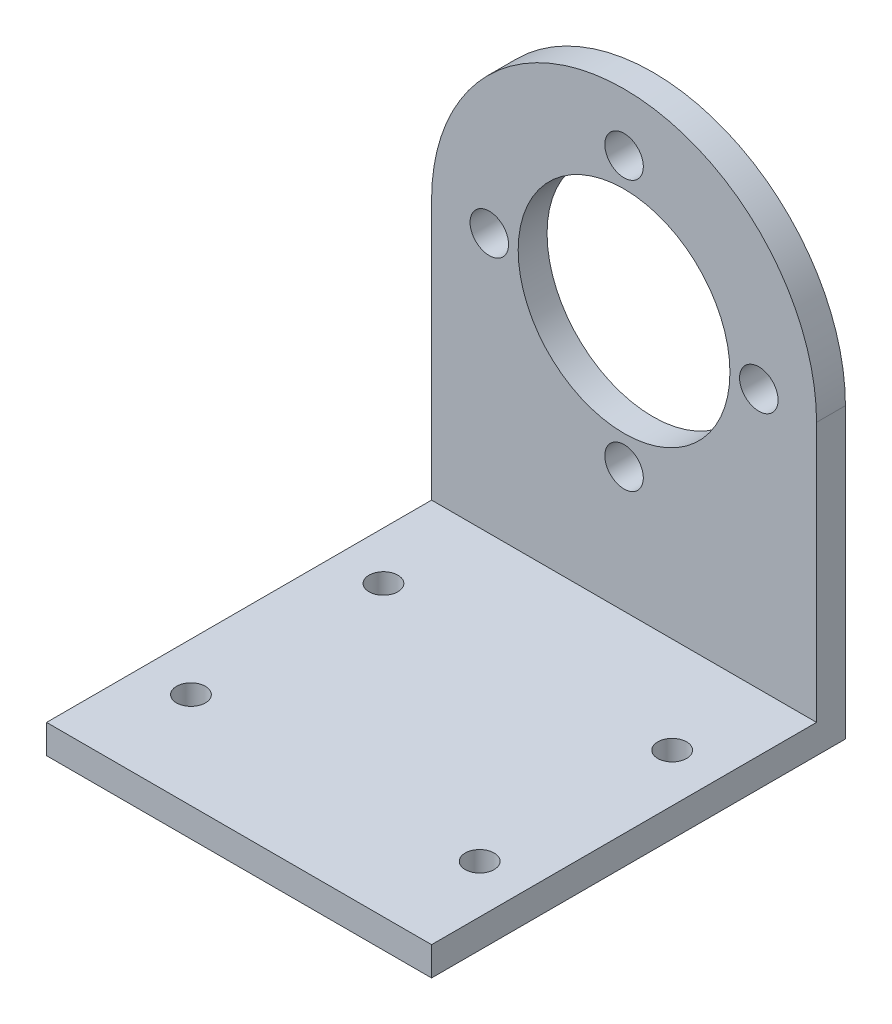
ISO-10303-21;
HEADER;
FILE_DESCRIPTION(('STEP AP214'),'2;1');
FILE_NAME('part.step','',(''),(''),'','','');
FILE_SCHEMA(('AUTOMOTIVE_DESIGN { 1 0 10303 214 1 1 1 1 }'));
ENDSEC;
DATA;
#1=APPLICATION_CONTEXT('core data for automotive mechanical design processes');
#2=APPLICATION_PROTOCOL_DEFINITION('international standard','automotive_design',2000,#1);
#3=PRODUCT_CONTEXT('',#1,'mechanical');
#4=PRODUCT('Part','Part','',(#3));
#5=PRODUCT_RELATED_PRODUCT_CATEGORY('part','',(#4));
#6=PRODUCT_DEFINITION_FORMATION('','',#4);
#7=PRODUCT_DEFINITION_CONTEXT('part definition',#1,'design');
#8=PRODUCT_DEFINITION('design','',#6,#7);
#9=PRODUCT_DEFINITION_SHAPE('','',#8);
#10=(LENGTH_UNIT() NAMED_UNIT(*) SI_UNIT(.MILLI.,.METRE.));
#11=(NAMED_UNIT(*) PLANE_ANGLE_UNIT() SI_UNIT($,.RADIAN.));
#12=(NAMED_UNIT(*) SI_UNIT($,.STERADIAN.) SOLID_ANGLE_UNIT());
#13=UNCERTAINTY_MEASURE_WITH_UNIT(LENGTH_MEASURE(1.E-05),#10,'distance_accuracy_value','');
#14=(GEOMETRIC_REPRESENTATION_CONTEXT(3) GLOBAL_UNCERTAINTY_ASSIGNED_CONTEXT((#13)) GLOBAL_UNIT_ASSIGNED_CONTEXT((#10,
#11,#12)) REPRESENTATION_CONTEXT('',''));
#15=CARTESIAN_POINT('',(0.,0.,0.));
#16=DIRECTION('',(0.,0.,1.));
#17=DIRECTION('',(1.,0.,0.));
#18=AXIS2_PLACEMENT_3D('',#15,#16,#17);
#19=CARTESIAN_POINT('',(0.,3.,0.));
#20=DIRECTION('',(0.,1.,0.));
#21=DIRECTION('',(0.,0.,1.));
#22=AXIS2_PLACEMENT_3D('',#19,#20,#21);
#23=PLANE('',#22);
#24=DIRECTION('',(1.,0.,0.));
#25=VECTOR('',#24,1.);
#26=CARTESIAN_POINT('',(0.,3.,-18.5));
#27=LINE('',#26,#25);
#28=CARTESIAN_POINT('',(-20.,3.,-18.5));
#29=VERTEX_POINT('',#28);
#30=CARTESIAN_POINT('',(20.,3.,-18.5));
#31=VERTEX_POINT('',#30);
#32=EDGE_CURVE('E55',#29,#31,#27,.T.);
#33=ORIENTED_EDGE('',*,*,#32,.F.);
#34=DIRECTION('',(0.,0.,1.));
#35=VECTOR('',#34,1.);
#36=CARTESIAN_POINT('',(-20.,3.,-21.5));
#37=LINE('',#36,#35);
#38=CARTESIAN_POINT('',(-20.,3.,21.5));
#39=VERTEX_POINT('',#38);
#40=EDGE_CURVE('E97',#29,#39,#37,.T.);
#41=ORIENTED_EDGE('',*,*,#40,.T.);
#42=DIRECTION('',(1.,0.,0.));
#43=VECTOR('',#42,1.);
#44=CARTESIAN_POINT('',(-20.,3.,21.5));
#45=LINE('',#44,#43);
#46=CARTESIAN_POINT('',(20.,3.,21.5));
#47=VERTEX_POINT('',#46);
#48=EDGE_CURVE('E164',#39,#47,#45,.T.);
#49=ORIENTED_EDGE('',*,*,#48,.T.);
#50=DIRECTION('',(0.,0.,-1.));
#51=VECTOR('',#50,1.);
#52=CARTESIAN_POINT('',(20.,3.,-21.5));
#53=LINE('',#52,#51);
#54=EDGE_CURVE('E60',#47,#31,#53,.T.);
#55=ORIENTED_EDGE('',*,*,#54,.T.);
#56=EDGE_LOOP('',(#33,#41,#49,#55));
#57=FACE_BOUND('',#56,.T.);
#58=CARTESIAN_POINT('',(15.,3.,-8.49999999999999));
#59=DIRECTION('',(0.,1.,0.));
#60=DIRECTION('',(0.,0.,1.));
#61=AXIS2_PLACEMENT_3D('',#58,#59,#60);
#62=CIRCLE('',#61,1.5);
#63=CARTESIAN_POINT('',(15.,3.,-6.99999999999999));
#64=VERTEX_POINT('',#63);
#65=EDGE_CURVE('E138',#64,#64,#62,.T.);
#66=ORIENTED_EDGE('',*,*,#65,.F.);
#67=EDGE_LOOP('',(#66));
#68=FACE_BOUND('',#67,.T.);
#69=CARTESIAN_POINT('',(-15.,3.,11.5));
#70=DIRECTION('',(0.,1.,0.));
#71=DIRECTION('',(0.,0.,1.));
#72=AXIS2_PLACEMENT_3D('',#69,#70,#71);
#73=CIRCLE('',#72,1.5);
#74=CARTESIAN_POINT('',(-15.,3.,13.));
#75=VERTEX_POINT('',#74);
#76=EDGE_CURVE('E154',#75,#75,#73,.T.);
#77=ORIENTED_EDGE('',*,*,#76,.F.);
#78=EDGE_LOOP('',(#77));
#79=FACE_BOUND('',#78,.T.);
#80=CARTESIAN_POINT('',(15.,3.,11.5));
#81=DIRECTION('',(0.,1.,0.));
#82=DIRECTION('',(0.,0.,1.));
#83=AXIS2_PLACEMENT_3D('',#80,#81,#82);
#84=CIRCLE('',#83,1.5);
#85=CARTESIAN_POINT('',(15.,3.,13.));
#86=VERTEX_POINT('',#85);
#87=EDGE_CURVE('E146',#86,#86,#84,.T.);
#88=ORIENTED_EDGE('',*,*,#87,.F.);
#89=EDGE_LOOP('',(#88));
#90=FACE_BOUND('',#89,.T.);
#91=CARTESIAN_POINT('',(-15.,3.,-8.5));
#92=DIRECTION('',(0.,1.,0.));
#93=DIRECTION('',(0.,0.,1.));
#94=AXIS2_PLACEMENT_3D('',#91,#92,#93);
#95=CIRCLE('',#94,1.5);
#96=CARTESIAN_POINT('',(-15.,3.,-7.));
#97=VERTEX_POINT('',#96);
#98=EDGE_CURVE('E130',#97,#97,#95,.T.);
#99=ORIENTED_EDGE('',*,*,#98,.F.);
#100=EDGE_LOOP('',(#99));
#101=FACE_BOUND('',#100,.T.);
#102=ADVANCED_FACE('F39',(#57,#68,#79,#90,#101),#23,.T.);
#103=CARTESIAN_POINT('',(0.,0.,0.));
#104=DIRECTION('',(0.,1.,0.));
#105=DIRECTION('',(0.,0.,1.));
#106=AXIS2_PLACEMENT_3D('',#103,#104,#105);
#107=PLANE('',#106);
#108=DIRECTION('',(1.,0.,0.));
#109=VECTOR('',#108,1.);
#110=CARTESIAN_POINT('',(-20.,0.,21.5));
#111=LINE('',#110,#109);
#112=CARTESIAN_POINT('',(-20.,0.,21.5));
#113=VERTEX_POINT('',#112);
#114=CARTESIAN_POINT('',(20.,0.,21.5));
#115=VERTEX_POINT('',#114);
#116=EDGE_CURVE('E173',#113,#115,#111,.T.);
#117=ORIENTED_EDGE('',*,*,#116,.F.);
#118=DIRECTION('',(0.,0.,1.));
#119=VECTOR('',#118,1.);
#120=CARTESIAN_POINT('',(-20.,0.,-21.5));
#121=LINE('',#120,#119);
#122=CARTESIAN_POINT('',(-20.,0.,-21.5));
#123=VERTEX_POINT('',#122);
#124=EDGE_CURVE('E158',#123,#113,#121,.T.);
#125=ORIENTED_EDGE('',*,*,#124,.F.);
#126=DIRECTION('',(-1.,0.,0.));
#127=VECTOR('',#126,1.);
#128=CARTESIAN_POINT('',(-20.,0.,-21.5));
#129=LINE('',#128,#127);
#130=CARTESIAN_POINT('',(20.,0.,-21.5));
#131=VERTEX_POINT('',#130);
#132=EDGE_CURVE('E165',#131,#123,#129,.T.);
#133=ORIENTED_EDGE('',*,*,#132,.F.);
#134=DIRECTION('',(0.,0.,-1.));
#135=VECTOR('',#134,1.);
#136=CARTESIAN_POINT('',(20.,0.,-21.5));
#137=LINE('',#136,#135);
#138=EDGE_CURVE('E176',#115,#131,#137,.T.);
#139=ORIENTED_EDGE('',*,*,#138,.F.);
#140=EDGE_LOOP('',(#117,#125,#133,#139));
#141=FACE_BOUND('',#140,.T.);
#142=CARTESIAN_POINT('',(-15.,0.,11.5));
#143=DIRECTION('',(0.,1.,0.));
#144=DIRECTION('',(0.,0.,1.));
#145=AXIS2_PLACEMENT_3D('',#142,#143,#144);
#146=CIRCLE('',#145,1.5);
#147=CARTESIAN_POINT('',(-15.,0.,13.));
#148=VERTEX_POINT('',#147);
#149=EDGE_CURVE('E150',#148,#148,#146,.T.);
#150=ORIENTED_EDGE('',*,*,#149,.T.);
#151=EDGE_LOOP('',(#150));
#152=FACE_BOUND('',#151,.T.);
#153=CARTESIAN_POINT('',(15.,0.,11.5));
#154=DIRECTION('',(0.,1.,0.));
#155=DIRECTION('',(0.,0.,1.));
#156=AXIS2_PLACEMENT_3D('',#153,#154,#155);
#157=CIRCLE('',#156,1.5);
#158=CARTESIAN_POINT('',(15.,0.,13.));
#159=VERTEX_POINT('',#158);
#160=EDGE_CURVE('E142',#159,#159,#157,.T.);
#161=ORIENTED_EDGE('',*,*,#160,.T.);
#162=EDGE_LOOP('',(#161));
#163=FACE_BOUND('',#162,.T.);
#164=CARTESIAN_POINT('',(15.,0.,-8.49999999999999));
#165=DIRECTION('',(0.,1.,0.));
#166=DIRECTION('',(0.,0.,1.));
#167=AXIS2_PLACEMENT_3D('',#164,#165,#166);
#168=CIRCLE('',#167,1.5);
#169=CARTESIAN_POINT('',(15.,0.,-6.99999999999999));
#170=VERTEX_POINT('',#169);
#171=EDGE_CURVE('E134',#170,#170,#168,.T.);
#172=ORIENTED_EDGE('',*,*,#171,.T.);
#173=EDGE_LOOP('',(#172));
#174=FACE_BOUND('',#173,.T.);
#175=CARTESIAN_POINT('',(-15.,0.,-8.5));
#176=DIRECTION('',(0.,1.,0.));
#177=DIRECTION('',(0.,0.,1.));
#178=AXIS2_PLACEMENT_3D('',#175,#176,#177);
#179=CIRCLE('',#178,1.5);
#180=CARTESIAN_POINT('',(-15.,0.,-7.));
#181=VERTEX_POINT('',#180);
#182=EDGE_CURVE('E129',#181,#181,#179,.T.);
#183=ORIENTED_EDGE('',*,*,#182,.T.);
#184=EDGE_LOOP('',(#183));
#185=FACE_BOUND('',#184,.T.);
#186=ADVANCED_FACE('F197',(#141,#152,#163,#174,#185),#107,.F.);
#187=CARTESIAN_POINT('',(-20.,3.,-21.5));
#188=DIRECTION('',(1.,0.,0.));
#189=DIRECTION('',(0.,0.,-1.));
#190=AXIS2_PLACEMENT_3D('',#187,#188,#189);
#191=PLANE('',#190);
#192=ORIENTED_EDGE('',*,*,#40,.F.);
#193=DIRECTION('',(0.,1.,0.));
#194=VECTOR('',#193,1.);
#195=CARTESIAN_POINT('',(-20.,0.,-18.5));
#196=LINE('',#195,#194);
#197=CARTESIAN_POINT('',(-20.,30.,-18.5));
#198=VERTEX_POINT('',#197);
#199=EDGE_CURVE('E91',#29,#198,#196,.T.);
#200=ORIENTED_EDGE('',*,*,#199,.T.);
#201=DIRECTION('',(0.,0.,-1.));
#202=VECTOR('',#201,1.);
#203=CARTESIAN_POINT('',(-20.,30.,-18.5));
#204=LINE('',#203,#202);
#205=CARTESIAN_POINT('',(-20.,30.,-21.5));
#206=VERTEX_POINT('',#205);
#207=EDGE_CURVE('E94',#198,#206,#204,.T.);
#208=ORIENTED_EDGE('',*,*,#207,.T.);
#209=DIRECTION('',(0.,-1.,0.));
#210=VECTOR('',#209,1.);
#211=CARTESIAN_POINT('',(-20.,3.,-21.5));
#212=LINE('',#211,#210);
#213=EDGE_CURVE('E170',#206,#123,#212,.T.);
#214=ORIENTED_EDGE('',*,*,#213,.T.);
#215=ORIENTED_EDGE('',*,*,#124,.T.);
#216=DIRECTION('',(0.,-1.,0.));
#217=VECTOR('',#216,1.);
#218=CARTESIAN_POINT('',(-20.,3.,21.5));
#219=LINE('',#218,#217);
#220=EDGE_CURVE('E11',#39,#113,#219,.T.);
#221=ORIENTED_EDGE('',*,*,#220,.F.);
#222=EDGE_LOOP('',(#192,#200,#208,#214,#215,#221));
#223=FACE_BOUND('',#222,.T.);
#224=ADVANCED_FACE('F41',(#223),#191,.F.);
#225=CARTESIAN_POINT('',(-20.,3.,21.5));
#226=DIRECTION('',(0.,0.,-1.));
#227=DIRECTION('',(-1.,0.,0.));
#228=AXIS2_PLACEMENT_3D('',#225,#226,#227);
#229=PLANE('',#228);
#230=ORIENTED_EDGE('',*,*,#116,.T.);
#231=DIRECTION('',(0.,-1.,0.));
#232=VECTOR('',#231,1.);
#233=CARTESIAN_POINT('',(20.,3.,21.5));
#234=LINE('',#233,#232);
#235=EDGE_CURVE('E48',#47,#115,#234,.T.);
#236=ORIENTED_EDGE('',*,*,#235,.F.);
#237=ORIENTED_EDGE('',*,*,#48,.F.);
#238=ORIENTED_EDGE('',*,*,#220,.T.);
#239=EDGE_LOOP('',(#230,#236,#237,#238));
#240=FACE_BOUND('',#239,.T.);
#241=ADVANCED_FACE('F203',(#240),#229,.F.);
#242=CARTESIAN_POINT('',(20.,3.,-21.5));
#243=DIRECTION('',(-1.,0.,0.));
#244=DIRECTION('',(0.,0.,1.));
#245=AXIS2_PLACEMENT_3D('',#242,#243,#244);
#246=PLANE('',#245);
#247=ORIENTED_EDGE('',*,*,#138,.T.);
#248=DIRECTION('',(0.,-1.,0.));
#249=VECTOR('',#248,1.);
#250=CARTESIAN_POINT('',(20.,3.,-21.5));
#251=LINE('',#250,#249);
#252=CARTESIAN_POINT('',(20.,30.,-21.5));
#253=VERTEX_POINT('',#252);
#254=EDGE_CURVE('E183',#253,#131,#251,.T.);
#255=ORIENTED_EDGE('',*,*,#254,.F.);
#256=DIRECTION('',(0.,0.,-1.));
#257=VECTOR('',#256,1.);
#258=CARTESIAN_POINT('',(20.,30.,-18.5));
#259=LINE('',#258,#257);
#260=CARTESIAN_POINT('',(20.,30.,-18.5));
#261=VERTEX_POINT('',#260);
#262=EDGE_CURVE('E111',#261,#253,#259,.T.);
#263=ORIENTED_EDGE('',*,*,#262,.F.);
#264=DIRECTION('',(0.,-1.,0.));
#265=VECTOR('',#264,1.);
#266=CARTESIAN_POINT('',(20.,0.,-18.5));
#267=LINE('',#266,#265);
#268=EDGE_CURVE('E112',#261,#31,#267,.T.);
#269=ORIENTED_EDGE('',*,*,#268,.T.);
#270=ORIENTED_EDGE('',*,*,#54,.F.);
#271=ORIENTED_EDGE('',*,*,#235,.T.);
#272=EDGE_LOOP('',(#247,#255,#263,#269,#270,#271));
#273=FACE_BOUND('',#272,.T.);
#274=ADVANCED_FACE('F191',(#273),#246,.F.);
#275=CARTESIAN_POINT('',(-20.,3.,-21.5));
#276=DIRECTION('',(0.,0.,1.));
#277=DIRECTION('',(1.,0.,0.));
#278=AXIS2_PLACEMENT_3D('',#275,#276,#277);
#279=PLANE('',#278);
#280=ORIENTED_EDGE('',*,*,#132,.T.);
#281=ORIENTED_EDGE('',*,*,#213,.F.);
#282=CARTESIAN_POINT('',(0.,30.,-21.5));
#283=DIRECTION('',(0.,0.,-1.));
#284=DIRECTION('',(1.,0.,0.));
#285=AXIS2_PLACEMENT_3D('',#282,#283,#284);
#286=CIRCLE('',#285,20.);
#287=EDGE_CURVE('E102',#206,#253,#286,.T.);
#288=ORIENTED_EDGE('',*,*,#287,.T.);
#289=ORIENTED_EDGE('',*,*,#254,.T.);
#290=EDGE_LOOP('',(#280,#281,#288,#289));
#291=FACE_BOUND('',#290,.T.);
#292=CARTESIAN_POINT('',(13.9999999999998,30.,-21.5));
#293=DIRECTION('',(0.,0.,-1.));
#294=DIRECTION('',(-1.,0.,0.));
#295=AXIS2_PLACEMENT_3D('',#292,#293,#294);
#296=CIRCLE('',#295,2.);
#297=CARTESIAN_POINT('',(11.9999999999998,30.,-21.5));
#298=VERTEX_POINT('',#297);
#299=EDGE_CURVE('E383',#298,#298,#296,.T.);
#300=ORIENTED_EDGE('',*,*,#299,.F.);
#301=EDGE_LOOP('',(#300));
#302=FACE_BOUND('',#301,.T.);
#303=CARTESIAN_POINT('',(-2.93868898324443E-13,16.,-21.5));
#304=DIRECTION('',(0.,0.,-1.));
#305=DIRECTION('',(-1.,0.,0.));
#306=AXIS2_PLACEMENT_3D('',#303,#304,#305);
#307=CIRCLE('',#306,2.);
#308=CARTESIAN_POINT('',(-2.00000000000029,16.,-21.5));
#309=VERTEX_POINT('',#308);
#310=EDGE_CURVE('E387',#309,#309,#307,.T.);
#311=ORIENTED_EDGE('',*,*,#310,.F.);
#312=EDGE_LOOP('',(#311));
#313=FACE_BOUND('',#312,.T.);
#314=CARTESIAN_POINT('',(-14.0000000000002,30.0000000000002,-21.5));
#315=DIRECTION('',(0.,0.,-1.));
#316=DIRECTION('',(-1.,0.,0.));
#317=AXIS2_PLACEMENT_3D('',#314,#315,#316);
#318=CIRCLE('',#317,2.);
#319=CARTESIAN_POINT('',(-16.0000000000002,30.0000000000002,-21.5));
#320=VERTEX_POINT('',#319);
#321=EDGE_CURVE('E394',#320,#320,#318,.T.);
#322=ORIENTED_EDGE('',*,*,#321,.F.);
#323=EDGE_LOOP('',(#322));
#324=FACE_BOUND('',#323,.T.);
#325=CARTESIAN_POINT('',(0.,44.,-21.5));
#326=DIRECTION('',(0.,0.,-1.));
#327=DIRECTION('',(-1.,0.,0.));
#328=AXIS2_PLACEMENT_3D('',#325,#326,#327);
#329=CIRCLE('',#328,2.);
#330=CARTESIAN_POINT('',(-2.,44.,-21.5));
#331=VERTEX_POINT('',#330);
#332=EDGE_CURVE('E402',#331,#331,#329,.T.);
#333=ORIENTED_EDGE('',*,*,#332,.F.);
#334=EDGE_LOOP('',(#333));
#335=FACE_BOUND('',#334,.T.);
#336=CARTESIAN_POINT('',(0.,30.,-21.5));
#337=DIRECTION('',(0.,0.,-1.));
#338=DIRECTION('',(-1.,0.,0.));
#339=AXIS2_PLACEMENT_3D('',#336,#337,#338);
#340=CIRCLE('',#339,11.);
#341=CARTESIAN_POINT('',(-11.,30.,-21.5));
#342=VERTEX_POINT('',#341);
#343=EDGE_CURVE('E410',#342,#342,#340,.T.);
#344=ORIENTED_EDGE('',*,*,#343,.F.);
#345=EDGE_LOOP('',(#344));
#346=FACE_BOUND('',#345,.T.);
#347=ADVANCED_FACE('F201',(#291,#302,#313,#324,#335,#346),#279,.F.);
#348=CARTESIAN_POINT('',(-15.,3.,11.5));
#349=DIRECTION('',(0.,-1.,0.));
#350=DIRECTION('',(0.,0.,-1.));
#351=AXIS2_PLACEMENT_3D('',#348,#349,#350);
#352=CYLINDRICAL_SURFACE('',#351,1.5);
#353=ORIENTED_EDGE('',*,*,#76,.T.);
#354=EDGE_LOOP('',(#353));
#355=FACE_BOUND('',#354,.T.);
#356=ORIENTED_EDGE('',*,*,#149,.F.);
#357=EDGE_LOOP('',(#356));
#358=FACE_BOUND('',#357,.T.);
#359=ADVANCED_FACE('F231',(#355,#358),#352,.F.);
#360=CARTESIAN_POINT('',(15.,3.,11.5));
#361=DIRECTION('',(0.,-1.,0.));
#362=DIRECTION('',(0.,0.,-1.));
#363=AXIS2_PLACEMENT_3D('',#360,#361,#362);
#364=CYLINDRICAL_SURFACE('',#363,1.5);
#365=ORIENTED_EDGE('',*,*,#87,.T.);
#366=EDGE_LOOP('',(#365));
#367=FACE_BOUND('',#366,.T.);
#368=ORIENTED_EDGE('',*,*,#160,.F.);
#369=EDGE_LOOP('',(#368));
#370=FACE_BOUND('',#369,.T.);
#371=ADVANCED_FACE('F253',(#367,#370),#364,.F.);
#372=CARTESIAN_POINT('',(15.,3.,-8.49999999999999));
#373=DIRECTION('',(0.,-1.,0.));
#374=DIRECTION('',(0.,0.,-1.));
#375=AXIS2_PLACEMENT_3D('',#372,#373,#374);
#376=CYLINDRICAL_SURFACE('',#375,1.5);
#377=ORIENTED_EDGE('',*,*,#65,.T.);
#378=EDGE_LOOP('',(#377));
#379=FACE_BOUND('',#378,.T.);
#380=ORIENTED_EDGE('',*,*,#171,.F.);
#381=EDGE_LOOP('',(#380));
#382=FACE_BOUND('',#381,.T.);
#383=ADVANCED_FACE('F218',(#379,#382),#376,.F.);
#384=CARTESIAN_POINT('',(-15.,3.,-8.5));
#385=DIRECTION('',(0.,-1.,0.));
#386=DIRECTION('',(0.,0.,-1.));
#387=AXIS2_PLACEMENT_3D('',#384,#385,#386);
#388=CYLINDRICAL_SURFACE('',#387,1.5);
#389=ORIENTED_EDGE('',*,*,#98,.T.);
#390=EDGE_LOOP('',(#389));
#391=FACE_BOUND('',#390,.T.);
#392=ORIENTED_EDGE('',*,*,#182,.F.);
#393=EDGE_LOOP('',(#392));
#394=FACE_BOUND('',#393,.T.);
#395=ADVANCED_FACE('F215',(#391,#394),#388,.F.);
#396=CARTESIAN_POINT('',(0.,30.,-18.5));
#397=DIRECTION('',(0.,0.,-1.));
#398=DIRECTION('',(-1.,0.,0.));
#399=AXIS2_PLACEMENT_3D('',#396,#397,#398);
#400=CYLINDRICAL_SURFACE('',#399,20.);
#401=ORIENTED_EDGE('',*,*,#287,.F.);
#402=ORIENTED_EDGE('',*,*,#207,.F.);
#403=CARTESIAN_POINT('',(0.,30.,-18.5));
#404=DIRECTION('',(0.,0.,-1.));
#405=DIRECTION('',(1.,0.,0.));
#406=AXIS2_PLACEMENT_3D('',#403,#404,#405);
#407=CIRCLE('',#406,20.);
#408=EDGE_CURVE('E101',#198,#261,#407,.T.);
#409=ORIENTED_EDGE('',*,*,#408,.T.);
#410=ORIENTED_EDGE('',*,*,#262,.T.);
#411=EDGE_LOOP('',(#401,#402,#409,#410));
#412=FACE_BOUND('',#411,.T.);
#413=ADVANCED_FACE('F106',(#412),#400,.T.);
#414=CARTESIAN_POINT('',(0.,30.,-18.5));
#415=DIRECTION('',(0.,0.,1.));
#416=DIRECTION('',(1.,0.,0.));
#417=AXIS2_PLACEMENT_3D('',#414,#415,#416);
#418=PLANE('',#417);
#419=CARTESIAN_POINT('',(13.9999999999998,30.,-18.5));
#420=DIRECTION('',(0.,0.,-1.));
#421=DIRECTION('',(-1.,0.,0.));
#422=AXIS2_PLACEMENT_3D('',#419,#420,#421);
#423=CIRCLE('',#422,2.);
#424=CARTESIAN_POINT('',(11.9999999999998,30.,-18.5));
#425=VERTEX_POINT('',#424);
#426=EDGE_CURVE('E380',#425,#425,#423,.T.);
#427=ORIENTED_EDGE('',*,*,#426,.T.);
#428=EDGE_LOOP('',(#427));
#429=FACE_BOUND('',#428,.T.);
#430=CARTESIAN_POINT('',(-2.94129106845839E-13,16.,-18.5));
#431=DIRECTION('',(0.,0.,-1.));
#432=DIRECTION('',(-1.,0.,0.));
#433=AXIS2_PLACEMENT_3D('',#430,#431,#432);
#434=CIRCLE('',#433,2.);
#435=CARTESIAN_POINT('',(-2.00000000000029,16.,-18.5));
#436=VERTEX_POINT('',#435);
#437=EDGE_CURVE('E390',#436,#436,#434,.T.);
#438=ORIENTED_EDGE('',*,*,#437,.T.);
#439=EDGE_LOOP('',(#438));
#440=FACE_BOUND('',#439,.T.);
#441=CARTESIAN_POINT('',(-14.0000000000002,30.0000000000002,-18.5));
#442=DIRECTION('',(0.,0.,-1.));
#443=DIRECTION('',(-1.,0.,0.));
#444=AXIS2_PLACEMENT_3D('',#441,#442,#443);
#445=CIRCLE('',#444,2.);
#446=CARTESIAN_POINT('',(-16.0000000000002,30.0000000000002,-18.5));
#447=VERTEX_POINT('',#446);
#448=EDGE_CURVE('E398',#447,#447,#445,.T.);
#449=ORIENTED_EDGE('',*,*,#448,.T.);
#450=EDGE_LOOP('',(#449));
#451=FACE_BOUND('',#450,.T.);
#452=CARTESIAN_POINT('',(0.,44.,-18.5));
#453=DIRECTION('',(0.,0.,-1.));
#454=DIRECTION('',(-1.,0.,0.));
#455=AXIS2_PLACEMENT_3D('',#452,#453,#454);
#456=CIRCLE('',#455,2.);
#457=CARTESIAN_POINT('',(-2.,44.,-18.5));
#458=VERTEX_POINT('',#457);
#459=EDGE_CURVE('E406',#458,#458,#456,.T.);
#460=ORIENTED_EDGE('',*,*,#459,.T.);
#461=EDGE_LOOP('',(#460));
#462=FACE_BOUND('',#461,.T.);
#463=CARTESIAN_POINT('',(0.,30.,-18.5));
#464=DIRECTION('',(0.,0.,-1.));
#465=DIRECTION('',(-1.,0.,0.));
#466=AXIS2_PLACEMENT_3D('',#463,#464,#465);
#467=CIRCLE('',#466,11.);
#468=CARTESIAN_POINT('',(-11.,30.,-18.5));
#469=VERTEX_POINT('',#468);
#470=EDGE_CURVE('E124',#469,#469,#467,.T.);
#471=ORIENTED_EDGE('',*,*,#470,.T.);
#472=EDGE_LOOP('',(#471));
#473=FACE_BOUND('',#472,.T.);
#474=ORIENTED_EDGE('',*,*,#199,.F.);
#475=ORIENTED_EDGE('',*,*,#32,.T.);
#476=ORIENTED_EDGE('',*,*,#268,.F.);
#477=ORIENTED_EDGE('',*,*,#408,.F.);
#478=EDGE_LOOP('',(#474,#475,#476,#477));
#479=FACE_BOUND('',#478,.T.);
#480=ADVANCED_FACE('F114',(#429,#440,#451,#462,#473,#479),#418,.T.);
#481=CARTESIAN_POINT('',(0.,30.,-18.5));
#482=DIRECTION('',(0.,0.,-1.));
#483=DIRECTION('',(-1.,0.,0.));
#484=AXIS2_PLACEMENT_3D('',#481,#482,#483);
#485=CYLINDRICAL_SURFACE('',#484,11.);
#486=ORIENTED_EDGE('',*,*,#470,.F.);
#487=EDGE_LOOP('',(#486));
#488=FACE_BOUND('',#487,.T.);
#489=ORIENTED_EDGE('',*,*,#343,.T.);
#490=EDGE_LOOP('',(#489));
#491=FACE_BOUND('',#490,.T.);
#492=ADVANCED_FACE('F284',(#488,#491),#485,.F.);
#493=CARTESIAN_POINT('',(0.,44.,-18.5));
#494=DIRECTION('',(0.,0.,-1.));
#495=DIRECTION('',(-1.,0.,0.));
#496=AXIS2_PLACEMENT_3D('',#493,#494,#495);
#497=CYLINDRICAL_SURFACE('',#496,2.);
#498=ORIENTED_EDGE('',*,*,#459,.F.);
#499=EDGE_LOOP('',(#498));
#500=FACE_BOUND('',#499,.T.);
#501=ORIENTED_EDGE('',*,*,#332,.T.);
#502=EDGE_LOOP('',(#501));
#503=FACE_BOUND('',#502,.T.);
#504=ADVANCED_FACE('F292',(#500,#503),#497,.F.);
#505=CARTESIAN_POINT('',(-14.0000000000002,30.0000000000002,-18.5));
#506=DIRECTION('',(0.,0.,-1.));
#507=DIRECTION('',(-1.,0.,0.));
#508=AXIS2_PLACEMENT_3D('',#505,#506,#507);
#509=CYLINDRICAL_SURFACE('',#508,2.);
#510=ORIENTED_EDGE('',*,*,#448,.F.);
#511=EDGE_LOOP('',(#510));
#512=FACE_BOUND('',#511,.T.);
#513=ORIENTED_EDGE('',*,*,#321,.T.);
#514=EDGE_LOOP('',(#513));
#515=FACE_BOUND('',#514,.T.);
#516=ADVANCED_FACE('F300',(#512,#515),#509,.F.);
#517=CARTESIAN_POINT('',(-2.94129106845839E-13,16.,-18.5));
#518=DIRECTION('',(0.,0.,-1.));
#519=DIRECTION('',(-1.,0.,0.));
#520=AXIS2_PLACEMENT_3D('',#517,#518,#519);
#521=CYLINDRICAL_SURFACE('',#520,2.);
#522=ORIENTED_EDGE('',*,*,#437,.F.);
#523=EDGE_LOOP('',(#522));
#524=FACE_BOUND('',#523,.T.);
#525=ORIENTED_EDGE('',*,*,#310,.T.);
#526=EDGE_LOOP('',(#525));
#527=FACE_BOUND('',#526,.T.);
#528=ADVANCED_FACE('F308',(#524,#527),#521,.F.);
#529=CARTESIAN_POINT('',(13.9999999999998,30.,-18.5));
#530=DIRECTION('',(0.,0.,-1.));
#531=DIRECTION('',(-1.,0.,0.));
#532=AXIS2_PLACEMENT_3D('',#529,#530,#531);
#533=CYLINDRICAL_SURFACE('',#532,2.);
#534=ORIENTED_EDGE('',*,*,#426,.F.);
#535=EDGE_LOOP('',(#534));
#536=FACE_BOUND('',#535,.T.);
#537=ORIENTED_EDGE('',*,*,#299,.T.);
#538=EDGE_LOOP('',(#537));
#539=FACE_BOUND('',#538,.T.);
#540=ADVANCED_FACE('F316',(#536,#539),#533,.F.);
#541=CLOSED_SHELL('',(#102,#186,#224,#241,#274,#347,#359,#371,#383,#395,#413,#480,#492,#504,
#516,#528,#540));
#542=MANIFOLD_SOLID_BREP('B2',#541);
#543=ADVANCED_BREP_SHAPE_REPRESENTATION('',(#18,#542),#14);
#544=SHAPE_DEFINITION_REPRESENTATION(#9,#543);
ENDSEC;
END-ISO-10303-21;
